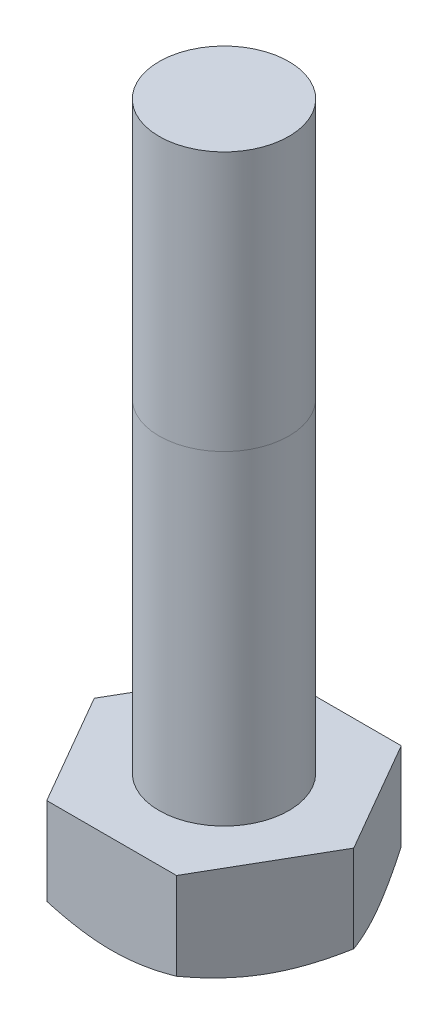
ISO-10303-21;
HEADER;
FILE_DESCRIPTION(('STEP AP214'),'2;1');
FILE_NAME('part.step','',(''),(''),'','','');
FILE_SCHEMA(('AUTOMOTIVE_DESIGN { 1 0 10303 214 1 1 1 1 }'));
ENDSEC;
DATA;
#1=APPLICATION_CONTEXT('core data for automotive mechanical design processes');
#2=APPLICATION_PROTOCOL_DEFINITION('international standard','automotive_design',2000,#1);
#3=PRODUCT_CONTEXT('',#1,'mechanical');
#4=PRODUCT('Part','Part','',(#3));
#5=PRODUCT_RELATED_PRODUCT_CATEGORY('part','',(#4));
#6=PRODUCT_DEFINITION_FORMATION('','',#4);
#7=PRODUCT_DEFINITION_CONTEXT('part definition',#1,'design');
#8=PRODUCT_DEFINITION('design','',#6,#7);
#9=PRODUCT_DEFINITION_SHAPE('','',#8);
#10=(LENGTH_UNIT() NAMED_UNIT(*) SI_UNIT(.MILLI.,.METRE.));
#11=(NAMED_UNIT(*) PLANE_ANGLE_UNIT() SI_UNIT($,.RADIAN.));
#12=(NAMED_UNIT(*) SI_UNIT($,.STERADIAN.) SOLID_ANGLE_UNIT());
#13=UNCERTAINTY_MEASURE_WITH_UNIT(LENGTH_MEASURE(1.E-05),#10,'distance_accuracy_value','');
#14=(GEOMETRIC_REPRESENTATION_CONTEXT(3) GLOBAL_UNCERTAINTY_ASSIGNED_CONTEXT((#13)) GLOBAL_UNIT_ASSIGNED_CONTEXT((#10,
#11,#12)) REPRESENTATION_CONTEXT('',''));
#15=CARTESIAN_POINT('',(0.,0.,0.));
#16=DIRECTION('',(0.,0.,1.));
#17=DIRECTION('',(1.,0.,0.));
#18=AXIS2_PLACEMENT_3D('',#15,#16,#17);
#19=CARTESIAN_POINT('',(0.,105.,0.));
#20=DIRECTION('',(0.,-1.,0.));
#21=DIRECTION('',(0.,0.,-1.));
#22=AXIS2_PLACEMENT_3D('',#19,#20,#21);
#23=CYLINDRICAL_SURFACE('',#22,10.);
#24=CARTESIAN_POINT('',(0.,15.,0.));
#25=DIRECTION('',(0.,1.,0.));
#26=DIRECTION('',(0.,0.,1.));
#27=AXIS2_PLACEMENT_3D('',#24,#25,#26);
#28=CIRCLE('',#27,10.);
#29=CARTESIAN_POINT('',(0.,15.,10.));
#30=VERTEX_POINT('',#29);
#31=EDGE_CURVE('E154',#30,#30,#28,.T.);
#32=ORIENTED_EDGE('',*,*,#31,.T.);
#33=EDGE_LOOP('',(#32));
#34=FACE_BOUND('',#33,.T.);
#35=CARTESIAN_POINT('',(0.,65.,0.));
#36=DIRECTION('',(0.,1.,0.));
#37=DIRECTION('',(0.,0.,1.));
#38=AXIS2_PLACEMENT_3D('',#35,#36,#37);
#39=CIRCLE('',#38,10.);
#40=CARTESIAN_POINT('',(0.,65.,10.));
#41=VERTEX_POINT('',#40);
#42=CARTESIAN_POINT('',(0.,65.,-10.));
#43=VERTEX_POINT('',#42);
#44=EDGE_CURVE('E12',#41,#43,#39,.T.);
#45=ORIENTED_EDGE('',*,*,#44,.F.);
#46=EDGE_CURVE('E41',#43,#41,#39,.T.);
#47=ORIENTED_EDGE('',*,*,#46,.F.);
#48=EDGE_LOOP('',(#45,#47));
#49=FACE_BOUND('',#48,.T.);
#50=ADVANCED_FACE('F36',(#34,#49),#23,.T.);
#51=CARTESIAN_POINT('',(10.0000000000002,15.,17.3205080756886));
#52=DIRECTION('',(-0.866025403784441,0.,-0.499999999999995));
#53=DIRECTION('',(-0.499999999999995,0.,0.866025403784441));
#54=AXIS2_PLACEMENT_3D('',#51,#52,#53);
#55=PLANE('',#54);
#56=CARTESIAN_POINT('',(20.0001154700538,1.54707205103645,-0.0002));
#57=CARTESIAN_POINT('',(19.7803195510107,1.42018146576655,0.380497699078994));
#58=CARTESIAN_POINT('',(19.5596663098864,1.29904896621149,0.76268032356092));
#59=CARTESIAN_POINT('',(19.1165904501199,1.06990068375397,1.53011022428389));
#60=CARTESIAN_POINT('',(18.8941672750157,0.961889214905724,1.91535846434513));
#61=CARTESIAN_POINT('',(18.4471216714826,0.760434886450478,2.68966416296479));
#62=CARTESIAN_POINT('',(18.2224953309622,0.66702649778655,3.07872839746427));
#63=CARTESIAN_POINT('',(17.7716818242103,0.496784115818114,3.85956029589702));
#64=CARTESIAN_POINT('',(17.5454947481335,0.419949173295097,4.2513278036775));
#65=CARTESIAN_POINT('',(17.0973554522432,0.286121698015613,5.02752783302751));
#66=CARTESIAN_POINT('',(16.8754365022277,0.228686220289232,5.41190272961676));
#67=CARTESIAN_POINT('',(16.4305817358325,0.132379782936891,6.18241378700247));
#68=CARTESIAN_POINT('',(16.207645899963,0.0935091806496661,6.56854998155617));
#69=CARTESIAN_POINT('',(15.761399735147,0.0353139542597744,7.34147101170029));
#70=CARTESIAN_POINT('',(15.5380901685615,0.015966103680015,7.72825452684256));
#71=CARTESIAN_POINT('',(15.0912649108274,-0.00276753156026079,8.50217857534307));
#72=CARTESIAN_POINT('',(14.8677492262615,-0.00215393304482407,8.88931909729987));
#73=CARTESIAN_POINT('',(14.4498812154449,0.0176412617726752,9.61308772289199));
#74=CARTESIAN_POINT('',(14.2554991166824,0.0344090109525431,9.94976739403052));
#75=CARTESIAN_POINT('',(13.8671985948882,0.0827234514403204,10.6223236263835));
#76=CARTESIAN_POINT('',(13.673280165256,0.114269931093013,10.9582001990304));
#77=CARTESIAN_POINT('',(13.2859804523276,0.191594441995693,11.6290229795793));
#78=CARTESIAN_POINT('',(13.0925998149689,0.237385342855868,11.9639680686847));
#79=CARTESIAN_POINT('',(12.706759116722,0.342390664506957,12.6322637616761));
#80=CARTESIAN_POINT('',(12.5142990519365,0.401605028416794,12.9656143723126));
#81=CARTESIAN_POINT('',(11.9300616903805,0.60088932058679,13.9775431662077));
#82=CARTESIAN_POINT('',(11.539976288474,0.760830493049595,14.6531909016005));
#83=CARTESIAN_POINT('',(10.7656220663232,1.12383132955027,15.9944117574213));
#84=CARTESIAN_POINT('',(10.3813433320871,1.32680574399828,16.6600020493865));
#85=CARTESIAN_POINT('',(9.99988452994635,1.54707205103645,17.3207080756886));
#86=B_SPLINE_CURVE_WITH_KNOTS('',3,(#56,#57,#58,#59,#60,#61,#62,#63,#64,#65,#66,#67,#68,#69,#70,
#71,#72,#73,#74,#75,#76,#77,#78,#79,#80,#81,#82,#83,#84,#85),.UNSPECIFIED.,.F.,.F.,(4,2,2,2,2,2,
2,2,2,2,2,2,2,2,4),(0.,1.37265379434071,2.74575768798323,4.12205542001801,5.49827430578547,
6.84052513875047,8.18280180646399,9.52347966022141,10.8641160860469,12.0312115970818,
13.1982903939406,14.366426705721,15.5345580676899,17.9222758503159,20.305306997128),.UNSPECIFIED.);
#87=CARTESIAN_POINT('',(20.,1.54700538379244,0.));
#88=VERTEX_POINT('',#87);
#89=CARTESIAN_POINT('',(15.0000000000001,0.,8.66025403784434));
#90=VERTEX_POINT('',#89);
#91=EDGE_CURVE('E202',#88,#90,#86,.T.);
#92=ORIENTED_EDGE('',*,*,#91,.F.);
#93=DIRECTION('',(0.,-1.,0.));
#94=VECTOR('',#93,1.);
#95=CARTESIAN_POINT('',(20.,15.,0.));
#96=LINE('',#95,#94);
#97=CARTESIAN_POINT('',(20.,15.,0.));
#98=VERTEX_POINT('',#97);
#99=EDGE_CURVE('E152',#98,#88,#96,.T.);
#100=ORIENTED_EDGE('',*,*,#99,.F.);
#101=DIRECTION('',(0.499999999999995,0.,-0.866025403784441));
#102=VECTOR('',#101,1.);
#103=CARTESIAN_POINT('',(10.0000000000002,15.,17.3205080756886));
#104=LINE('',#103,#102);
#105=CARTESIAN_POINT('',(10.0000000000002,15.,17.3205080756886));
#106=VERTEX_POINT('',#105);
#107=EDGE_CURVE('E274',#106,#98,#104,.T.);
#108=ORIENTED_EDGE('',*,*,#107,.F.);
#109=DIRECTION('',(0.,-1.,0.));
#110=VECTOR('',#109,1.);
#111=CARTESIAN_POINT('',(10.0000000000002,15.,17.3205080756886));
#112=LINE('',#111,#110);
#113=CARTESIAN_POINT('',(10.0000000000002,1.54700538379243,17.3205080756886));
#114=VERTEX_POINT('',#113);
#115=EDGE_CURVE('E139',#106,#114,#112,.T.);
#116=ORIENTED_EDGE('',*,*,#115,.T.);
#117=EDGE_CURVE('E133',#90,#114,#86,.T.);
#118=ORIENTED_EDGE('',*,*,#117,.F.);
#119=EDGE_LOOP('',(#92,#100,#108,#116,#118));
#120=FACE_BOUND('',#119,.T.);
#121=ADVANCED_FACE('F38',(#120),#55,.F.);
#122=CARTESIAN_POINT('',(20.,15.,0.));
#123=DIRECTION('',(-0.866025403784438,0.,0.500000000000001));
#124=DIRECTION('',(0.500000000000001,0.,0.866025403784438));
#125=AXIS2_PLACEMENT_3D('',#122,#123,#124);
#126=PLANE('',#125);
#127=CARTESIAN_POINT('',(9.9998845299461,1.54707205103645,-17.3207080756888));
#128=CARTESIAN_POINT('',(10.2196804489892,1.42018146576654,-16.9400103766098));
#129=CARTESIAN_POINT('',(10.4403336901135,1.29904896621149,-16.5578277521278));
#130=CARTESIAN_POINT('',(10.88340954988,1.06990068375396,-15.7903978514049));
#131=CARTESIAN_POINT('',(11.1058327249842,0.961889214905715,-15.4051496113436));
#132=CARTESIAN_POINT('',(11.5528783285173,0.760434886450466,-14.630843912724));
#133=CARTESIAN_POINT('',(11.7775046690377,0.667026497786536,-14.2417796782245));
#134=CARTESIAN_POINT('',(12.2283181757897,0.496784115818097,-13.4609477797918));
#135=CARTESIAN_POINT('',(12.4545052518665,0.419949173295077,-13.0691802720113));
#136=CARTESIAN_POINT('',(12.9026445477567,0.286121698015588,-12.2929802426613));
#137=CARTESIAN_POINT('',(13.1245634977722,0.228686220289206,-11.908605346072));
#138=CARTESIAN_POINT('',(13.5694182641675,0.132379782936862,-11.1380942886863));
#139=CARTESIAN_POINT('',(13.7923541000369,0.0935091806496363,-10.7519580941326));
#140=CARTESIAN_POINT('',(14.2386002648529,0.0353139542597401,-9.97903706398851));
#141=CARTESIAN_POINT('',(14.4619098314384,0.0159661036799778,-9.59225354884624));
#142=CARTESIAN_POINT('',(14.9087350891725,-0.00276753156030364,-8.81832950034573));
#143=CARTESIAN_POINT('',(15.1322507737385,-0.0021539330448696,-8.43118897838894));
#144=CARTESIAN_POINT('',(15.5501187845551,0.0176412617726289,-7.70742035279681));
#145=CARTESIAN_POINT('',(15.7445008833176,0.0344090109524986,-7.37074068165828));
#146=CARTESIAN_POINT('',(16.1328014051118,0.0827234514402753,-6.69818444930525));
#147=CARTESIAN_POINT('',(16.326719834744,0.114269931092966,-6.36230787665834));
#148=CARTESIAN_POINT('',(16.7140195476724,0.191594441995645,-5.69148509610941));
#149=CARTESIAN_POINT('',(16.9074001850311,0.237385342855821,-5.35654000700408));
#150=CARTESIAN_POINT('',(17.293240883278,0.342390664506914,-4.68824431401261));
#151=CARTESIAN_POINT('',(17.4857009480636,0.401605028416752,-4.35489370337608));
#152=CARTESIAN_POINT('',(18.0699383096196,0.600889320586754,-3.34296490948103));
#153=CARTESIAN_POINT('',(18.460023711526,0.760830493049565,-2.66731717408818));
#154=CARTESIAN_POINT('',(19.2343779336769,1.12383132955025,-1.32609631826739));
#155=CARTESIAN_POINT('',(19.618656667913,1.32680574399828,-0.660506026302154));
#156=CARTESIAN_POINT('',(20.0001154700538,1.54707205103645,0.000199999999998817));
#157=B_SPLINE_CURVE_WITH_KNOTS('',3,(#127,#128,#129,#130,#131,#132,#133,#134,#135,#136,#137,
#138,#139,#140,#141,#142,#143,#144,#145,#146,#147,#148,#149,#150,#151,#152,#153,#154,#155,#156),
.UNSPECIFIED.,.F.,.F.,(4,2,2,2,2,2,2,2,2,2,2,2,2,2,4),(0.,1.3726537943407,2.74575768798322,
4.12205542001801,5.49827430578547,6.84052513875047,8.18280180646398,9.5234796602214,
10.8641160860469,12.0312115970818,13.1982903939407,14.3664267057211,15.53455806769,
17.9222758503161,20.3053069971282),.UNSPECIFIED.);
#158=CARTESIAN_POINT('',(9.99999999999994,1.54700538379243,-17.3205080756888));
#159=VERTEX_POINT('',#158);
#160=CARTESIAN_POINT('',(15.0000000000001,0.,-8.66025403784445));
#161=VERTEX_POINT('',#160);
#162=EDGE_CURVE('E190',#159,#161,#157,.T.);
#163=ORIENTED_EDGE('',*,*,#162,.F.);
#164=DIRECTION('',(0.,-1.,0.));
#165=VECTOR('',#164,1.);
#166=CARTESIAN_POINT('',(9.99999999999994,15.,-17.3205080756888));
#167=LINE('',#166,#165);
#168=CARTESIAN_POINT('',(9.99999999999994,15.,-17.3205080756888));
#169=VERTEX_POINT('',#168);
#170=EDGE_CURVE('E149',#169,#159,#167,.T.);
#171=ORIENTED_EDGE('',*,*,#170,.F.);
#172=DIRECTION('',(-0.500000000000001,0.,-0.866025403784438));
#173=VECTOR('',#172,1.);
#174=CARTESIAN_POINT('',(20.,15.,0.));
#175=LINE('',#174,#173);
#176=EDGE_CURVE('E276',#98,#169,#175,.T.);
#177=ORIENTED_EDGE('',*,*,#176,.F.);
#178=ORIENTED_EDGE('',*,*,#99,.T.);
#179=EDGE_CURVE('E193',#161,#88,#157,.T.);
#180=ORIENTED_EDGE('',*,*,#179,.F.);
#181=EDGE_LOOP('',(#163,#171,#177,#178,#180));
#182=FACE_BOUND('',#181,.T.);
#183=ADVANCED_FACE('F241',(#182),#126,.F.);
#184=CARTESIAN_POINT('',(9.99999999999994,15.,-17.3205080756888));
#185=DIRECTION('',(0.,0.,1.));
#186=DIRECTION('',(1.,0.,0.));
#187=AXIS2_PLACEMENT_3D('',#184,#185,#186);
#188=PLANE('',#187);
#189=CARTESIAN_POINT('',(-35.0002000000001,12.5463522551504,-17.3205080756886));
#190=CARTESIAN_POINT('',(-34.594137349599,12.3362348835198,-17.3205080756886));
#191=CARTESIAN_POINT('',(-34.1877829039591,12.126681587728,-17.3205080756886));
#192=CARTESIAN_POINT('',(-33.3744338694678,11.7088182396156,-17.3205080756886));
#193=CARTESIAN_POINT('',(-32.9674392787615,11.5005081909062,-17.3205080756886));
#194=CARTESIAN_POINT('',(-31.7453787417218,10.8775994086899,-17.3205080756886));
#195=CARTESIAN_POINT('',(-30.9292711669502,10.4650402454852,-17.3205080756886));
#196=CARTESIAN_POINT('',(-29.2924702097004,9.64588151678353,-17.3205080756886));
#197=CARTESIAN_POINT('',(-28.4717716511968,9.23929228161182,-17.3205080756886));
#198=CARTESIAN_POINT('',(-26.8264017657734,8.43425273894365,-17.3205080756886));
#199=CARTESIAN_POINT('',(-26.0017304995047,8.03580230767574,-17.3205080756886));
#200=CARTESIAN_POINT('',(-24.3029908307603,7.22779705469609,-17.3205080756886));
#201=CARTESIAN_POINT('',(-23.428655737607,6.81880126574398,-17.3205080756886));
#202=CARTESIAN_POINT('',(-21.6733855750682,6.01509448525061,-17.3205080756887));
#203=CARTESIAN_POINT('',(-20.7924502429791,5.62038406598299,-17.3205080756887));
#204=CARTESIAN_POINT('',(-19.0229510281901,4.84963496345148,-17.3205080756887));
#205=CARTESIAN_POINT('',(-18.1343914849559,4.47358639091456,-17.3205080756887));
#206=CARTESIAN_POINT('',(-16.7941706131401,3.92772325473194,-17.3205080756887));
#207=CARTESIAN_POINT('',(-16.3462126010612,3.74880854382262,-17.3205080756887));
#208=CARTESIAN_POINT('',(-15.4475674642223,3.39798040591231,-17.3205080756887));
#209=CARTESIAN_POINT('',(-14.9968803941126,3.22606683924029,-17.3205080756887));
#210=CARTESIAN_POINT('',(-14.0262783668964,2.86570175425555,-17.3205080756887));
#211=CARTESIAN_POINT('',(-13.5058917294668,2.67851570273084,-17.3205080756887));
#212=CARTESIAN_POINT('',(-12.4608100305045,2.31661449156762,-17.3205080756887));
#213=CARTESIAN_POINT('',(-11.9361151665268,2.14189876362039,-17.3205080756887));
#214=CARTESIAN_POINT('',(-10.8819408587431,1.80710038574992,-17.3205080756887));
#215=CARTESIAN_POINT('',(-10.3524604922482,1.64702062689539,-17.3205080756887));
#216=CARTESIAN_POINT('',(-9.28857134004609,1.34406555475621,-17.3205080756887));
#217=CARTESIAN_POINT('',(-8.7541625624875,1.20119021303107,-17.3205080756887));
#218=CARTESIAN_POINT('',(-7.69096618917054,0.938082320566732,-17.3205080756887));
#219=CARTESIAN_POINT('',(-7.1622761486796,0.817458172493093,-17.3205080756887));
#220=CARTESIAN_POINT('',(-6.10035716875712,0.598248232649965,-17.3205080756887));
#221=CARTESIAN_POINT('',(-5.56712863122368,0.499660510136085,-17.3205080756887));
#222=CARTESIAN_POINT('',(-4.49688553378006,0.327280223234774,-17.3205080756887));
#223=CARTESIAN_POINT('',(-3.95987277720638,0.253476569375774,-17.3205080756887));
#224=CARTESIAN_POINT('',(-2.88279091983594,0.132973558648197,-17.3205080756887));
#225=CARTESIAN_POINT('',(-2.34272186311575,0.0862738119002124,-17.3205080756887));
#226=CARTESIAN_POINT('',(-1.25267123056087,0.0211608710382198,-17.3205080756887));
#227=CARTESIAN_POINT('',(-0.702663140287767,0.00318556071919197,-17.3205080756887));
#228=CARTESIAN_POINT('',(0.397508224460564,-0.00240957975092294,-17.3205080756887));
#229=CARTESIAN_POINT('',(0.947671498865402,0.00997057635043729,-17.3205080756887));
#230=CARTESIAN_POINT('',(2.04662194168162,0.064605326450931,-17.3205080756887));
#231=CARTESIAN_POINT('',(2.59540876468059,0.106866787329433,-17.3205080756887));
#232=CARTESIAN_POINT('',(3.69004562597613,0.219691676003218,-17.3205080756887));
#233=CARTESIAN_POINT('',(4.23589558916484,0.290255824163457,-17.3205080756887));
#234=CARTESIAN_POINT('',(5.33479772199162,0.459025678311713,-17.3205080756887));
#235=CARTESIAN_POINT('',(5.88776614189472,0.557771628750648,-17.3205080756887));
#236=CARTESIAN_POINT('',(6.9888852153132,0.779270888483442,-17.3205080756887));
#237=CARTESIAN_POINT('',(7.53703538726083,0.902026569590802,-17.3205080756887));
#238=CARTESIAN_POINT('',(8.62832434164031,1.16845790543212,-17.3205080756888));
#239=CARTESIAN_POINT('',(9.17146192722054,1.31213842563476,-17.3205080756888));
#240=CARTESIAN_POINT('',(10.2526435291593,1.61743398482004,-17.3205080756888));
#241=CARTESIAN_POINT('',(10.7906875240283,1.77904909943099,-17.3205080756888));
#242=CARTESIAN_POINT('',(11.8578440716816,2.11625010320123,-17.3205080756888));
#243=CARTESIAN_POINT('',(12.3869934445496,2.2917200676285,-17.3205080756888));
#244=CARTESIAN_POINT('',(13.4408989961676,2.65542424408253,-17.3205080756888));
#245=CARTESIAN_POINT('',(13.9656549531211,2.84365909621659,-17.3205080756888));
#246=CARTESIAN_POINT('',(15.0112683729155,3.23099069507446,-17.3205080756888));
#247=CARTESIAN_POINT('',(15.5321248992446,3.4300899615528,-17.3205080756888));
#248=CARTESIAN_POINT('',(16.570213976791,3.83747417187008,-17.3205080756888));
#249=CARTESIAN_POINT('',(17.0874465851673,4.04575897044823,-17.3205080756888));
#250=CARTESIAN_POINT('',(18.1193191268702,4.47041393629471,-17.3205080756888));
#251=CARTESIAN_POINT('',(18.6339550876329,4.68679373551423,-17.3205080756888));
#252=CARTESIAN_POINT('',(19.6603532363293,5.12625737755059,-17.3205080756888));
#253=CARTESIAN_POINT('',(20.1721154154587,5.34934124089264,-17.3205080756888));
#254=CARTESIAN_POINT('',(21.1930219711227,5.8012317394181,-17.3205080756888));
#255=CARTESIAN_POINT('',(21.7021666866254,6.03003760986906,-17.3205080756888));
#256=CARTESIAN_POINT('',(22.7181974089432,6.4926147337151,-17.3205080756888));
#257=CARTESIAN_POINT('',(23.2250833956178,6.726386031279,-17.3205080756888));
#258=CARTESIAN_POINT('',(24.6826194303234,7.40609203033377,-17.3205080756888));
#259=CARTESIAN_POINT('',(25.6307327911279,7.85746843820373,-17.3205080756888));
#260=CARTESIAN_POINT('',(27.5213135261769,8.77193699754897,-17.3205080756888));
#261=CARTESIAN_POINT('',(28.4637806901992,9.23502958193497,-17.3205080756888));
#262=CARTESIAN_POINT('',(30.3407180245028,10.1687310927736,-17.3205080756888));
#263=CARTESIAN_POINT('',(31.2752048003642,10.6393066770128,-17.3205080756888));
#264=CARTESIAN_POINT('',(32.6740999720779,11.350630240917,-17.3205080756888));
#265=CARTESIAN_POINT('',(33.1399056353816,11.5886376403937,-17.3205080756888));
#266=CARTESIAN_POINT('',(34.0706679333409,12.0663017496142,-17.3205080756888));
#267=CARTESIAN_POINT('',(34.5356245719401,12.3059584516726,-17.3205080756888));
#268=CARTESIAN_POINT('',(35.0001999999999,12.5463522551504,-17.3205080756888));
#269=B_SPLINE_CURVE_WITH_KNOTS('',3,(#189,#190,#191,#192,#193,#194,#195,#196,#197,#198,#199,
#200,#201,#202,#203,#204,#205,#206,#207,#208,#209,#210,#211,#212,#213,#214,#215,#216,#217,#218,
#219,#220,#221,#222,#223,#224,#225,#226,#227,#228,#229,#230,#231,#232,#233,#234,#235,#236,#237,
#238,#239,#240,#241,#242,#243,#244,#245,#246,#247,#248,#249,#250,#251,#252,#253,#254,#255,#256,
#257,#258,#259,#260,#261,#262,#263,#264,#265,#266,#267,#268),.UNSPECIFIED.,.F.,.F.,(4,2,2,2,2,2,
2,2,2,2,2,2,2,2,2,2,2,2,2,2,2,2,2,2,2,2,2,2,2,2,2,2,2,2,2,2,2,2,2,4),(0.,1.37161344579353,
2.7432308736518,5.48658444706689,8.23422875979911,10.9818312563728,13.8775275628596,
16.7733397431781,19.6676006216986,21.1146507212927,22.5616719384504,24.2206229328047,
25.8794982756246,27.5387005942374,29.1979001699968,30.8243176182081,32.4505925102536,
34.0761387635025,35.7016616333065,37.3517358560537,39.0018093315062,40.6522621257284,
42.3027569302302,43.9873035112168,45.6720165851214,47.3571220178305,49.042234556723,
50.7144979923092,52.3868453472153,54.0595822274557,55.7322926643705,57.4070609905288,
59.0818344446946,60.7563852531483,62.43095096343,65.5810612708419,68.7312881447791,
71.8700925066505,73.4393579802908,75.0086161464313),.UNSPECIFIED.);
#270=CARTESIAN_POINT('',(-10.0000000000001,1.54700538379244,-17.3205080756887));
#271=VERTEX_POINT('',#270);
#272=CARTESIAN_POINT('',(0.,0.,-17.3205080756889));
#273=VERTEX_POINT('',#272);
#274=EDGE_CURVE('E176',#271,#273,#269,.T.);
#275=ORIENTED_EDGE('',*,*,#274,.F.);
#276=DIRECTION('',(0.,-1.,0.));
#277=VECTOR('',#276,1.);
#278=CARTESIAN_POINT('',(-10.0000000000001,15.,-17.3205080756887));
#279=LINE('',#278,#277);
#280=CARTESIAN_POINT('',(-10.0000000000001,15.,-17.3205080756887));
#281=VERTEX_POINT('',#280);
#282=EDGE_CURVE('E141',#281,#271,#279,.T.);
#283=ORIENTED_EDGE('',*,*,#282,.F.);
#284=DIRECTION('',(-1.,0.,0.));
#285=VECTOR('',#284,1.);
#286=CARTESIAN_POINT('',(9.99999999999994,15.,-17.3205080756888));
#287=LINE('',#286,#285);
#288=EDGE_CURVE('E280',#169,#281,#287,.T.);
#289=ORIENTED_EDGE('',*,*,#288,.F.);
#290=ORIENTED_EDGE('',*,*,#170,.T.);
#291=EDGE_CURVE('E189',#273,#159,#269,.T.);
#292=ORIENTED_EDGE('',*,*,#291,.F.);
#293=EDGE_LOOP('',(#275,#283,#289,#290,#292));
#294=FACE_BOUND('',#293,.T.);
#295=ADVANCED_FACE('F244',(#294),#188,.F.);
#296=CARTESIAN_POINT('',(-10.0000000000001,15.,-17.3205080756887));
#297=DIRECTION('',(0.866025403784442,0.,0.499999999999995));
#298=DIRECTION('',(0.499999999999995,0.,-0.866025403784442));
#299=AXIS2_PLACEMENT_3D('',#296,#297,#298);
#300=PLANE('',#299);
#301=CARTESIAN_POINT('',(-20.0001154700538,1.54707205103645,0.000200000000139659));
#302=CARTESIAN_POINT('',(-19.7803195510107,1.42018146576654,-0.380497699078852));
#303=CARTESIAN_POINT('',(-19.5596663098864,1.29904896621148,-0.762680323560778));
#304=CARTESIAN_POINT('',(-19.1165904501199,1.06990068375396,-1.53011022428375));
#305=CARTESIAN_POINT('',(-18.8941672750157,0.961889214905715,-1.91535846434498));
#306=CARTESIAN_POINT('',(-18.4471216714826,0.760434886450468,-2.68966416296465));
#307=CARTESIAN_POINT('',(-18.2224953309622,0.667026497786539,-3.07872839746413));
#308=CARTESIAN_POINT('',(-17.7716818242103,0.496784115818099,-3.85956029589688));
#309=CARTESIAN_POINT('',(-17.5454947481335,0.419949173295077,-4.25132780367736));
#310=CARTESIAN_POINT('',(-17.0973554522432,0.286121698015588,-5.02752783302736));
#311=CARTESIAN_POINT('',(-16.8754365022277,0.228686220289206,-5.41190272961661));
#312=CARTESIAN_POINT('',(-16.4305817358325,0.132379782936862,-6.18241378700233));
#313=CARTESIAN_POINT('',(-16.207645899963,0.0935091806496358,-6.56854998155603));
#314=CARTESIAN_POINT('',(-15.761399735147,0.0353139542597397,-7.34147101170014));
#315=CARTESIAN_POINT('',(-15.5380901685615,0.0159661036799777,-7.72825452684241));
#316=CARTESIAN_POINT('',(-15.0912649108274,-0.00276753156030351,-8.50217857534292));
#317=CARTESIAN_POINT('',(-14.8677492262615,-0.00215393304486953,-8.88931909729972));
#318=CARTESIAN_POINT('',(-14.4498812154449,0.0176412617726279,-9.61308772289185));
#319=CARTESIAN_POINT('',(-14.2554991166824,0.0344090109524967,-9.94976739403038));
#320=CARTESIAN_POINT('',(-13.8671985948882,0.0827234514402742,-10.6223236263834));
#321=CARTESIAN_POINT('',(-13.673280165256,0.114269931092967,-10.9582001990303));
#322=CARTESIAN_POINT('',(-13.2859804523275,0.191594441995646,-11.6290229795793));
#323=CARTESIAN_POINT('',(-13.0925998149688,0.237385342855821,-11.9639680686846));
#324=CARTESIAN_POINT('',(-12.7067591167219,0.342390664506912,-12.6322637616761));
#325=CARTESIAN_POINT('',(-12.5142990519364,0.401605028416751,-12.9656143723126));
#326=CARTESIAN_POINT('',(-11.9300616903804,0.600889320586752,-13.9775431662077));
#327=CARTESIAN_POINT('',(-11.539976288474,0.760830493049563,-14.6531909016005));
#328=CARTESIAN_POINT('',(-10.7656220663231,1.12383132955025,-15.9944117574213));
#329=CARTESIAN_POINT('',(-10.381343332087,1.32680574399827,-16.6600020493865));
#330=CARTESIAN_POINT('',(-9.99988452994622,1.54707205103645,-17.3207080756887));
#331=B_SPLINE_CURVE_WITH_KNOTS('',3,(#301,#302,#303,#304,#305,#306,#307,#308,#309,#310,#311,
#312,#313,#314,#315,#316,#317,#318,#319,#320,#321,#322,#323,#324,#325,#326,#327,#328,#329,#330),
.UNSPECIFIED.,.F.,.F.,(4,2,2,2,2,2,2,2,2,2,2,2,2,2,4),(0.,1.3726537943407,2.74575768798322,
4.12205542001801,5.49827430578547,6.84052513875047,8.18280180646399,9.52347966022141,
10.8641160860469,12.0312115970818,13.1982903939407,14.3664267057211,15.53455806769,
17.9222758503161,20.3053069971282),.UNSPECIFIED.);
#332=CARTESIAN_POINT('',(-20.,1.54700538379244,1.39692241658733E-13));
#333=VERTEX_POINT('',#332);
#334=CARTESIAN_POINT('',(-15.0000000000001,0.,-8.66025403784434));
#335=VERTEX_POINT('',#334);
#336=EDGE_CURVE('E186',#333,#335,#331,.T.);
#337=ORIENTED_EDGE('',*,*,#336,.F.);
#338=DIRECTION('',(0.,-1.,0.));
#339=VECTOR('',#338,1.);
#340=CARTESIAN_POINT('',(-20.,15.,1.39659253553725E-13));
#341=LINE('',#340,#339);
#342=CARTESIAN_POINT('',(-20.,15.,1.39659253553725E-13));
#343=VERTEX_POINT('',#342);
#344=EDGE_CURVE('E138',#343,#333,#341,.T.);
#345=ORIENTED_EDGE('',*,*,#344,.F.);
#346=DIRECTION('',(-0.499999999999995,0.,0.866025403784442));
#347=VECTOR('',#346,1.);
#348=CARTESIAN_POINT('',(-10.0000000000001,15.,-17.3205080756887));
#349=LINE('',#348,#347);
#350=EDGE_CURVE('E282',#281,#343,#349,.T.);
#351=ORIENTED_EDGE('',*,*,#350,.F.);
#352=ORIENTED_EDGE('',*,*,#282,.T.);
#353=EDGE_CURVE('E174',#335,#271,#331,.T.);
#354=ORIENTED_EDGE('',*,*,#353,.F.);
#355=EDGE_LOOP('',(#337,#345,#351,#352,#354));
#356=FACE_BOUND('',#355,.T.);
#357=ADVANCED_FACE('F184',(#356),#300,.F.);
#358=CARTESIAN_POINT('',(-20.,15.,1.39659253553725E-13));
#359=DIRECTION('',(0.866025403784435,0.,-0.500000000000007));
#360=DIRECTION('',(-0.500000000000007,0.,-0.866025403784435));
#361=AXIS2_PLACEMENT_3D('',#358,#359,#360);
#362=PLANE('',#361);
#363=CARTESIAN_POINT('',(-9.99988452994598,1.54707205103645,17.3207080756888));
#364=CARTESIAN_POINT('',(-10.2196804489891,1.42018146576654,16.9400103766098));
#365=CARTESIAN_POINT('',(-10.4403336901134,1.29904896621148,16.5578277521279));
#366=CARTESIAN_POINT('',(-10.8834095498799,1.06990068375396,15.790397851405));
#367=CARTESIAN_POINT('',(-11.1058327249841,0.961889214905717,15.4051496113437));
#368=CARTESIAN_POINT('',(-11.5528783285172,0.760434886450468,14.6308439127241));
#369=CARTESIAN_POINT('',(-11.7775046690376,0.667026497786538,14.2417796782246));
#370=CARTESIAN_POINT('',(-12.2283181757896,0.496784115818097,13.4609477797918));
#371=CARTESIAN_POINT('',(-12.4545052518664,0.419949173295077,13.0691802720114));
#372=CARTESIAN_POINT('',(-12.9026445477566,0.286121698015589,12.2929802426614));
#373=CARTESIAN_POINT('',(-13.1245634977722,0.228686220289209,11.9086053460721));
#374=CARTESIAN_POINT('',(-13.5694182641674,0.132379782936864,11.1380942886864));
#375=CARTESIAN_POINT('',(-13.7923541000368,0.0935091806496355,10.7519580941327));
#376=CARTESIAN_POINT('',(-14.2386002648529,0.0353139542597389,9.97903706398861));
#377=CARTESIAN_POINT('',(-14.4619098314384,0.0159661036799789,9.59225354884634));
#378=CARTESIAN_POINT('',(-14.9087350891725,-0.00276753156030172,8.81832950034584));
#379=CARTESIAN_POINT('',(-15.1322507737384,-0.00215393304486912,8.43118897838904));
#380=CARTESIAN_POINT('',(-15.5501187845551,0.0176412617726285,7.70742035279692));
#381=CARTESIAN_POINT('',(-15.7445008833176,0.0344090109524986,7.37074068165838));
#382=CARTESIAN_POINT('',(-16.1328014051118,0.0827234514402756,6.69818444930536));
#383=CARTESIAN_POINT('',(-16.3267198347439,0.114269931092966,6.36230787665845));
#384=CARTESIAN_POINT('',(-16.7140195476724,0.191594441995645,5.69148509610953));
#385=CARTESIAN_POINT('',(-16.9074001850311,0.237385342855821,5.3565400070042));
#386=CARTESIAN_POINT('',(-17.293240883278,0.342390664506913,4.68824431401273));
#387=CARTESIAN_POINT('',(-17.4857009480635,0.401605028416752,4.3548937033762));
#388=CARTESIAN_POINT('',(-18.0699383096196,0.600889320586753,3.34296490948115));
#389=CARTESIAN_POINT('',(-18.460023711526,0.760830493049564,2.66731717408831));
#390=CARTESIAN_POINT('',(-19.2343779336769,1.12383132955025,1.32609631826752));
#391=CARTESIAN_POINT('',(-19.618656667913,1.32680574399827,0.660506026302289));
#392=CARTESIAN_POINT('',(-20.0001154700538,1.54707205103645,-0.000199999999858909));
#393=B_SPLINE_CURVE_WITH_KNOTS('',3,(#363,#364,#365,#366,#367,#368,#369,#370,#371,#372,#373,
#374,#375,#376,#377,#378,#379,#380,#381,#382,#383,#384,#385,#386,#387,#388,#389,#390,#391,#392),
.UNSPECIFIED.,.F.,.F.,(4,2,2,2,2,2,2,2,2,2,2,2,2,2,4),(0.,1.3726537943407,2.74575768798322,
4.12205542001801,5.49827430578547,6.84052513875047,8.18280180646399,9.52347966022141,
10.8641160860469,12.0312115970818,13.1982903939407,14.3664267057211,15.53455806769,
17.9222758503161,20.3053069971282),.UNSPECIFIED.);
#394=CARTESIAN_POINT('',(-9.99999999999985,1.54700538379242,17.3205080756888));
#395=VERTEX_POINT('',#394);
#396=CARTESIAN_POINT('',(-15.,0.,8.66025403784455));
#397=VERTEX_POINT('',#396);
#398=EDGE_CURVE('E114',#395,#397,#393,.T.);
#399=ORIENTED_EDGE('',*,*,#398,.F.);
#400=DIRECTION('',(0.,-1.,0.));
#401=VECTOR('',#400,1.);
#402=CARTESIAN_POINT('',(-9.99999999999982,15.,17.3205080756888));
#403=LINE('',#402,#401);
#404=CARTESIAN_POINT('',(-9.99999999999982,15.,17.3205080756888));
#405=VERTEX_POINT('',#404);
#406=EDGE_CURVE('E129',#405,#395,#403,.T.);
#407=ORIENTED_EDGE('',*,*,#406,.F.);
#408=DIRECTION('',(0.500000000000007,0.,0.866025403784435));
#409=VECTOR('',#408,1.);
#410=CARTESIAN_POINT('',(-20.,15.,1.39659253553725E-13));
#411=LINE('',#410,#409);
#412=EDGE_CURVE('E284',#343,#405,#411,.T.);
#413=ORIENTED_EDGE('',*,*,#412,.F.);
#414=ORIENTED_EDGE('',*,*,#344,.T.);
#415=EDGE_CURVE('E132',#397,#333,#393,.T.);
#416=ORIENTED_EDGE('',*,*,#415,.F.);
#417=EDGE_LOOP('',(#399,#407,#413,#414,#416));
#418=FACE_BOUND('',#417,.T.);
#419=ADVANCED_FACE('F127',(#418),#362,.F.);
#420=CARTESIAN_POINT('',(-9.99999999999982,15.,17.3205080756888));
#421=DIRECTION('',(0.,0.,-1.));
#422=DIRECTION('',(-1.,0.,0.));
#423=AXIS2_PLACEMENT_3D('',#420,#421,#422);
#424=PLANE('',#423);
#425=CARTESIAN_POINT('',(35.0002000000002,12.5463522551504,17.3205080756884));
#426=CARTESIAN_POINT('',(34.5941373495992,12.3362348835198,17.3205080756884));
#427=CARTESIAN_POINT('',(34.1877829039592,12.126681587728,17.3205080756884));
#428=CARTESIAN_POINT('',(33.374433869468,11.7088182396156,17.3205080756884));
#429=CARTESIAN_POINT('',(32.9674392787617,11.5005081909062,17.3205080756884));
#430=CARTESIAN_POINT('',(31.7453787417219,10.8775994086899,17.3205080756884));
#431=CARTESIAN_POINT('',(30.9292711669503,10.4650402454852,17.3205080756884));
#432=CARTESIAN_POINT('',(29.2924702097005,9.64588151678352,17.3205080756884));
#433=CARTESIAN_POINT('',(28.471771651197,9.23929228161181,17.3205080756884));
#434=CARTESIAN_POINT('',(26.8264017657735,8.43425273894365,17.3205080756884));
#435=CARTESIAN_POINT('',(26.0017304995048,8.03580230767574,17.3205080756885));
#436=CARTESIAN_POINT('',(24.3029908307604,7.22779705469608,17.3205080756885));
#437=CARTESIAN_POINT('',(23.4286557376071,6.81880126574397,17.3205080756885));
#438=CARTESIAN_POINT('',(21.6733855750684,6.01509448525061,17.3205080756885));
#439=CARTESIAN_POINT('',(20.7924502429792,5.62038406598298,17.3205080756885));
#440=CARTESIAN_POINT('',(19.0229510281902,4.84963496345147,17.3205080756885));
#441=CARTESIAN_POINT('',(18.134391484956,4.47358639091456,17.3205080756885));
#442=CARTESIAN_POINT('',(16.7941706131402,3.92772325473194,17.3205080756885));
#443=CARTESIAN_POINT('',(16.3462126010613,3.74880854382261,17.3205080756886));
#444=CARTESIAN_POINT('',(15.4475674642224,3.39798040591231,17.3205080756886));
#445=CARTESIAN_POINT('',(14.9968803941127,3.22606683924029,17.3205080756886));
#446=CARTESIAN_POINT('',(14.0262783668965,2.86570175425555,17.3205080756886));
#447=CARTESIAN_POINT('',(13.5058917294669,2.67851570273084,17.3205080756886));
#448=CARTESIAN_POINT('',(12.4608100305046,2.31661449156762,17.3205080756886));
#449=CARTESIAN_POINT('',(11.936115166527,2.14189876362039,17.3205080756886));
#450=CARTESIAN_POINT('',(10.8819408587432,1.80710038574992,17.3205080756886));
#451=CARTESIAN_POINT('',(10.3524604922484,1.64702062689539,17.3205080756886));
#452=CARTESIAN_POINT('',(9.28857134004622,1.34406555475621,17.3205080756886));
#453=CARTESIAN_POINT('',(8.75416256248763,1.20119021303107,17.3205080756886));
#454=CARTESIAN_POINT('',(7.69096618917067,0.938082320566731,17.3205080756886));
#455=CARTESIAN_POINT('',(7.16227614867973,0.817458172493093,17.3205080756886));
#456=CARTESIAN_POINT('',(6.10035716875725,0.598248232649965,17.3205080756887));
#457=CARTESIAN_POINT('',(5.56712863122381,0.499660510136086,17.3205080756887));
#458=CARTESIAN_POINT('',(4.49688553378019,0.327280223234775,17.3205080756887));
#459=CARTESIAN_POINT('',(3.95987277720651,0.253476569375774,17.3205080756887));
#460=CARTESIAN_POINT('',(2.88279091983607,0.132973558648196,17.3205080756887));
#461=CARTESIAN_POINT('',(2.34272186311588,0.0862738119002109,17.3205080756887));
#462=CARTESIAN_POINT('',(1.25267123056099,0.0211608710382182,17.3205080756887));
#463=CARTESIAN_POINT('',(0.702663140287892,0.00318556071919093,17.3205080756887));
#464=CARTESIAN_POINT('',(-0.397508224460442,-0.00240957975092318,17.3205080756887));
#465=CARTESIAN_POINT('',(-0.94767149886528,0.00997057635043712,17.3205080756887));
#466=CARTESIAN_POINT('',(-2.04662194168149,0.0646053264509317,17.3205080756887));
#467=CARTESIAN_POINT('',(-2.59540876468047,0.106866787329434,17.3205080756888));
#468=CARTESIAN_POINT('',(-3.69004562597601,0.219691676003219,17.3205080756888));
#469=CARTESIAN_POINT('',(-4.23589558916472,0.290255824163458,17.3205080756888));
#470=CARTESIAN_POINT('',(-5.33479772199149,0.459025678311712,17.3205080756888));
#471=CARTESIAN_POINT('',(-5.8877661418946,0.557771628750647,17.3205080756888));
#472=CARTESIAN_POINT('',(-6.98888521531307,0.779270888483441,17.3205080756888));
#473=CARTESIAN_POINT('',(-7.5370353872607,0.902026569590802,17.3205080756888));
#474=CARTESIAN_POINT('',(-8.62832434164018,1.16845790543212,17.3205080756888));
#475=CARTESIAN_POINT('',(-9.17146192722041,1.31213842563476,17.3205080756888));
#476=CARTESIAN_POINT('',(-10.2526435291591,1.61743398482004,17.3205080756888));
#477=CARTESIAN_POINT('',(-10.7906875240281,1.77904909943099,17.3205080756888));
#478=CARTESIAN_POINT('',(-11.8578440716815,2.11625010320123,17.3205080756889));
#479=CARTESIAN_POINT('',(-12.3869934445494,2.2917200676285,17.3205080756889));
#480=CARTESIAN_POINT('',(-13.4408989961675,2.65542424408253,17.3205080756889));
#481=CARTESIAN_POINT('',(-13.965654953121,2.84365909621658,17.3205080756889));
#482=CARTESIAN_POINT('',(-15.0112683729153,3.23099069507445,17.3205080756889));
#483=CARTESIAN_POINT('',(-15.5321248992445,3.43008996155279,17.3205080756889));
#484=CARTESIAN_POINT('',(-16.5702139767908,3.83747417187008,17.3205080756889));
#485=CARTESIAN_POINT('',(-17.0874465851671,4.04575897044823,17.3205080756889));
#486=CARTESIAN_POINT('',(-18.11931912687,4.47041393629471,17.3205080756889));
#487=CARTESIAN_POINT('',(-18.6339550876328,4.68679373551423,17.3205080756889));
#488=CARTESIAN_POINT('',(-19.6603532363291,5.12625737755058,17.3205080756889));
#489=CARTESIAN_POINT('',(-20.1721154154586,5.34934124089263,17.3205080756889));
#490=CARTESIAN_POINT('',(-21.1930219711225,5.80123173941809,17.3205080756889));
#491=CARTESIAN_POINT('',(-21.7021666866252,6.03003760986905,17.320508075689));
#492=CARTESIAN_POINT('',(-22.7181974089431,6.49261473371509,17.320508075689));
#493=CARTESIAN_POINT('',(-23.2250833956177,6.72638603127899,17.320508075689));
#494=CARTESIAN_POINT('',(-24.6826194303233,7.40609203033377,17.320508075689));
#495=CARTESIAN_POINT('',(-25.6307327911278,7.85746843820373,17.320508075689));
#496=CARTESIAN_POINT('',(-27.5213135261767,8.77193699754897,17.320508075689));
#497=CARTESIAN_POINT('',(-28.4637806901991,9.23502958193497,17.320508075689));
#498=CARTESIAN_POINT('',(-30.3407180245027,10.1687310927735,17.320508075689));
#499=CARTESIAN_POINT('',(-31.2752048003641,10.6393066770128,17.3205080756891));
#500=CARTESIAN_POINT('',(-32.6740999720778,11.350630240917,17.3205080756891));
#501=CARTESIAN_POINT('',(-33.1399056353815,11.5886376403937,17.3205080756891));
#502=CARTESIAN_POINT('',(-34.0706679333408,12.0663017496142,17.3205080756891));
#503=CARTESIAN_POINT('',(-34.53562457194,12.3059584516726,17.3205080756891));
#504=CARTESIAN_POINT('',(-35.0001999999998,12.5463522551505,17.3205080756891));
#505=B_SPLINE_CURVE_WITH_KNOTS('',3,(#425,#426,#427,#428,#429,#430,#431,#432,#433,#434,#435,
#436,#437,#438,#439,#440,#441,#442,#443,#444,#445,#446,#447,#448,#449,#450,#451,#452,#453,#454,
#455,#456,#457,#458,#459,#460,#461,#462,#463,#464,#465,#466,#467,#468,#469,#470,#471,#472,#473,
#474,#475,#476,#477,#478,#479,#480,#481,#482,#483,#484,#485,#486,#487,#488,#489,#490,#491,#492,
#493,#494,#495,#496,#497,#498,#499,#500,#501,#502,#503,#504),.UNSPECIFIED.,.F.,.F.,(4,2,2,2,2,2,
2,2,2,2,2,2,2,2,2,2,2,2,2,2,2,2,2,2,2,2,2,2,2,2,2,2,2,2,2,2,2,2,2,4),(0.,1.37161344579353,
2.74323087365181,5.4865844470669,8.23422875979912,10.9818312563729,13.8775275628596,
16.7733397431781,19.6676006216986,21.1146507212927,22.5616719384504,24.2206229328047,
25.8794982756246,27.5387005942374,29.1979001699968,30.8243176182081,32.4505925102536,
34.0761387635025,35.7016616333065,37.3517358560537,39.0018093315062,40.6522621257284,
42.3027569302302,43.9873035112168,45.6720165851214,47.3571220178305,49.042234556723,
50.7144979923091,52.3868453472153,54.0595822274557,55.7322926643705,57.4070609905288,
59.0818344446946,60.7563852531482,62.43095096343,65.5810612708419,68.7312881447791,
71.8700925066505,73.4393579802909,75.0086161464314),.UNSPECIFIED.);
#506=CARTESIAN_POINT('',(1.83282381045933E-13,0.,17.3205080756887));
#507=VERTEX_POINT('',#506);
#508=EDGE_CURVE('E121',#114,#507,#505,.T.);
#509=ORIENTED_EDGE('',*,*,#508,.F.);
#510=ORIENTED_EDGE('',*,*,#115,.F.);
#511=DIRECTION('',(1.,0.,0.));
#512=VECTOR('',#511,1.);
#513=CARTESIAN_POINT('',(-9.99999999999982,15.,17.3205080756888));
#514=LINE('',#513,#512);
#515=EDGE_CURVE('E137',#405,#106,#514,.T.);
#516=ORIENTED_EDGE('',*,*,#515,.F.);
#517=ORIENTED_EDGE('',*,*,#406,.T.);
#518=EDGE_CURVE('E111',#507,#395,#505,.T.);
#519=ORIENTED_EDGE('',*,*,#518,.F.);
#520=EDGE_LOOP('',(#509,#510,#516,#517,#519));
#521=FACE_BOUND('',#520,.T.);
#522=ADVANCED_FACE('F135',(#521),#424,.F.);
#523=CARTESIAN_POINT('',(0.,15.,0.));
#524=DIRECTION('',(0.,1.,0.));
#525=DIRECTION('',(0.,0.,1.));
#526=AXIS2_PLACEMENT_3D('',#523,#524,#525);
#527=PLANE('',#526);
#528=ORIENTED_EDGE('',*,*,#31,.F.);
#529=EDGE_LOOP('',(#528));
#530=FACE_BOUND('',#529,.T.);
#531=ORIENTED_EDGE('',*,*,#107,.T.);
#532=ORIENTED_EDGE('',*,*,#176,.T.);
#533=ORIENTED_EDGE('',*,*,#288,.T.);
#534=ORIENTED_EDGE('',*,*,#350,.T.);
#535=ORIENTED_EDGE('',*,*,#412,.T.);
#536=ORIENTED_EDGE('',*,*,#515,.T.);
#537=EDGE_LOOP('',(#531,#532,#533,#534,#535,#536));
#538=FACE_BOUND('',#537,.T.);
#539=ADVANCED_FACE('F263',(#530,#538),#527,.T.);
#540=ORIENTED_EDGE('',*,*,#46,.T.);
#541=ORIENTED_EDGE('',*,*,#44,.T.);
#542=EDGE_LOOP('',(#540,#541));
#543=FACE_BOUND('',#542,.T.);
#544=CARTESIAN_POINT('',(0.,105.,0.));
#545=DIRECTION('',(0.,1.,0.));
#546=DIRECTION('',(0.,0.,1.));
#547=AXIS2_PLACEMENT_3D('',#544,#545,#546);
#548=CIRCLE('',#547,10.);
#549=CARTESIAN_POINT('',(0.,105.,10.));
#550=VERTEX_POINT('',#549);
#551=EDGE_CURVE('E273',#550,#550,#548,.T.);
#552=ORIENTED_EDGE('',*,*,#551,.F.);
#553=EDGE_LOOP('',(#552));
#554=FACE_BOUND('',#553,.T.);
#555=ADVANCED_FACE('F256',(#543,#554),#23,.T.);
#556=CARTESIAN_POINT('',(0.,105.,0.));
#557=DIRECTION('',(0.,1.,0.));
#558=DIRECTION('',(0.,0.,1.));
#559=AXIS2_PLACEMENT_3D('',#556,#557,#558);
#560=PLANE('',#559);
#561=ORIENTED_EDGE('',*,*,#551,.T.);
#562=EDGE_LOOP('',(#561));
#563=FACE_BOUND('',#562,.T.);
#564=ADVANCED_FACE('F224',(#563),#560,.T.);
#565=CARTESIAN_POINT('',(0.,0.,0.));
#566=DIRECTION('',(0.,1.,0.));
#567=DIRECTION('',(0.,0.,-1.));
#568=AXIS2_PLACEMENT_3D('',#565,#566,#567);
#569=CONICAL_SURFACE('',#568,17.3205080756889,1.0471975511966);
#570=ORIENTED_EDGE('',*,*,#398,.T.);
#571=CARTESIAN_POINT('',(0.,0.,0.));
#572=DIRECTION('',(0.,1.,0.));
#573=DIRECTION('',(0.,0.,1.));
#574=AXIS2_PLACEMENT_3D('',#571,#572,#573);
#575=CIRCLE('',#574,17.3205080756889);
#576=EDGE_CURVE('E116',#397,#507,#575,.T.);
#577=ORIENTED_EDGE('',*,*,#576,.T.);
#578=ORIENTED_EDGE('',*,*,#518,.T.);
#579=EDGE_LOOP('',(#570,#577,#578));
#580=FACE_BOUND('',#579,.T.);
#581=ADVANCED_FACE('F113',(#580),#569,.T.);
#582=ORIENTED_EDGE('',*,*,#336,.T.);
#583=EDGE_CURVE('E155',#335,#397,#575,.T.);
#584=ORIENTED_EDGE('',*,*,#583,.T.);
#585=ORIENTED_EDGE('',*,*,#415,.T.);
#586=EDGE_LOOP('',(#582,#584,#585));
#587=FACE_BOUND('',#586,.T.);
#588=ADVANCED_FACE('F223',(#587),#569,.T.);
#589=ORIENTED_EDGE('',*,*,#274,.T.);
#590=EDGE_CURVE('E157',#273,#335,#575,.T.);
#591=ORIENTED_EDGE('',*,*,#590,.T.);
#592=ORIENTED_EDGE('',*,*,#353,.T.);
#593=EDGE_LOOP('',(#589,#591,#592));
#594=FACE_BOUND('',#593,.T.);
#595=ADVANCED_FACE('F172',(#594),#569,.T.);
#596=ORIENTED_EDGE('',*,*,#291,.T.);
#597=ORIENTED_EDGE('',*,*,#162,.T.);
#598=CARTESIAN_POINT('',(0.,0.,0.));
#599=DIRECTION('',(0.,-1.,0.));
#600=DIRECTION('',(0.,0.,-1.));
#601=AXIS2_PLACEMENT_3D('',#598,#599,#600);
#602=CIRCLE('',#601,17.3205080756889);
#603=EDGE_CURVE('E122',#273,#161,#602,.T.);
#604=ORIENTED_EDGE('',*,*,#603,.F.);
#605=EDGE_LOOP('',(#596,#597,#604));
#606=FACE_BOUND('',#605,.T.);
#607=ADVANCED_FACE('F222',(#606),#569,.T.);
#608=ORIENTED_EDGE('',*,*,#179,.T.);
#609=ORIENTED_EDGE('',*,*,#91,.T.);
#610=EDGE_CURVE('E161',#90,#161,#575,.T.);
#611=ORIENTED_EDGE('',*,*,#610,.T.);
#612=EDGE_LOOP('',(#608,#609,#611));
#613=FACE_BOUND('',#612,.T.);
#614=ADVANCED_FACE('F297',(#613),#569,.T.);
#615=ORIENTED_EDGE('',*,*,#117,.T.);
#616=ORIENTED_EDGE('',*,*,#508,.T.);
#617=EDGE_CURVE('E156',#507,#90,#575,.T.);
#618=ORIENTED_EDGE('',*,*,#617,.T.);
#619=EDGE_LOOP('',(#615,#616,#618));
#620=FACE_BOUND('',#619,.T.);
#621=ADVANCED_FACE('F295',(#620),#569,.T.);
#622=CARTESIAN_POINT('',(0.,0.,0.));
#623=DIRECTION('',(0.,1.,0.));
#624=DIRECTION('',(0.,0.,1.));
#625=AXIS2_PLACEMENT_3D('',#622,#623,#624);
#626=PLANE('',#625);
#627=ORIENTED_EDGE('',*,*,#617,.F.);
#628=ORIENTED_EDGE('',*,*,#576,.F.);
#629=ORIENTED_EDGE('',*,*,#583,.F.);
#630=ORIENTED_EDGE('',*,*,#590,.F.);
#631=ORIENTED_EDGE('',*,*,#603,.T.);
#632=ORIENTED_EDGE('',*,*,#610,.F.);
#633=EDGE_LOOP('',(#627,#628,#629,#630,#631,#632));
#634=FACE_BOUND('',#633,.T.);
#635=ADVANCED_FACE('F180',(#634),#626,.F.);
#636=CLOSED_SHELL('',(#50,#121,#183,#295,#357,#419,#522,#539,#555,#564,#581,#588,#595,#607,#614,
#621,#635));
#637=MANIFOLD_SOLID_BREP('B2',#636);
#638=ADVANCED_BREP_SHAPE_REPRESENTATION('',(#18,#637),#14);
#639=SHAPE_DEFINITION_REPRESENTATION(#9,#638);
ENDSEC;
END-ISO-10303-21;
